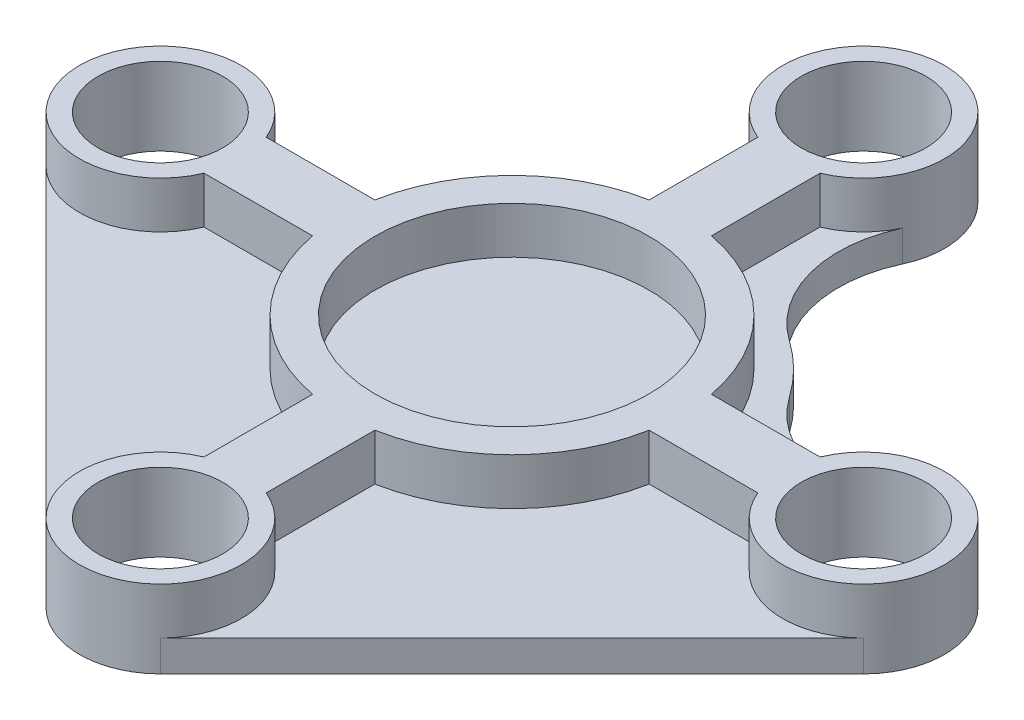
ISO-10303-21;
HEADER;
FILE_DESCRIPTION(('STEP AP214'),'2;1');
FILE_NAME('part.step','',(''),(''),'','','');
FILE_SCHEMA(('AUTOMOTIVE_DESIGN { 1 0 10303 214 1 1 1 1 }'));
ENDSEC;
DATA;
#1=APPLICATION_CONTEXT('core data for automotive mechanical design processes');
#2=APPLICATION_PROTOCOL_DEFINITION('international standard','automotive_design',2000,#1);
#3=PRODUCT_CONTEXT('',#1,'mechanical');
#4=PRODUCT('Part','Part','',(#3));
#5=PRODUCT_RELATED_PRODUCT_CATEGORY('part','',(#4));
#6=PRODUCT_DEFINITION_FORMATION('','',#4);
#7=PRODUCT_DEFINITION_CONTEXT('part definition',#1,'design');
#8=PRODUCT_DEFINITION('design','',#6,#7);
#9=PRODUCT_DEFINITION_SHAPE('','',#8);
#10=(LENGTH_UNIT() NAMED_UNIT(*) SI_UNIT(.MILLI.,.METRE.));
#11=(NAMED_UNIT(*) PLANE_ANGLE_UNIT() SI_UNIT($,.RADIAN.));
#12=(NAMED_UNIT(*) SI_UNIT($,.STERADIAN.) SOLID_ANGLE_UNIT());
#13=UNCERTAINTY_MEASURE_WITH_UNIT(LENGTH_MEASURE(1.E-05),#10,'distance_accuracy_value','');
#14=(GEOMETRIC_REPRESENTATION_CONTEXT(3) GLOBAL_UNCERTAINTY_ASSIGNED_CONTEXT((#13)) GLOBAL_UNIT_ASSIGNED_CONTEXT((#10,
#11,#12)) REPRESENTATION_CONTEXT('',''));
#15=CARTESIAN_POINT('',(0.,0.,0.));
#16=DIRECTION('',(0.,0.,1.));
#17=DIRECTION('',(1.,0.,0.));
#18=AXIS2_PLACEMENT_3D('',#15,#16,#17);
#19=CARTESIAN_POINT('',(-59.8055256368753,10.,-85.0840707964602));
#20=DIRECTION('',(0.,1.,0.));
#21=DIRECTION('',(0.,0.,1.));
#22=AXIS2_PLACEMENT_3D('',#19,#20,#21);
#23=PLANE('',#22);
#24=CARTESIAN_POINT('',(-113.,10.,0.));
#25=DIRECTION('',(0.,1.,0.));
#26=DIRECTION('',(0.,0.,1.));
#27=AXIS2_PLACEMENT_3D('',#24,#25,#26);
#28=CIRCLE('',#27,26.);
#29=CARTESIAN_POINT('',(-89.,10.,-9.99999999999998));
#30=VERTEX_POINT('',#29);
#31=CARTESIAN_POINT('',(-102.002815768302,10.,-23.5597525236176));
#32=VERTEX_POINT('',#31);
#33=EDGE_CURVE('E281',#30,#32,#28,.T.);
#34=ORIENTED_EDGE('',*,*,#33,.F.);
#35=DIRECTION('',(1.,0.,0.));
#36=VECTOR('',#35,1.);
#37=CARTESIAN_POINT('',(-89.,10.,-9.99999999999998));
#38=LINE('',#37,#36);
#39=CARTESIAN_POINT('',(-54.0832691319598,10.,-9.99999999999999));
#40=VERTEX_POINT('',#39);
#41=EDGE_CURVE('E244',#30,#40,#38,.T.);
#42=ORIENTED_EDGE('',*,*,#41,.T.);
#43=CARTESIAN_POINT('',(0.,10.,0.));
#44=DIRECTION('',(0.,1.,0.));
#45=DIRECTION('',(0.,0.,1.));
#46=AXIS2_PLACEMENT_3D('',#43,#44,#45);
#47=CIRCLE('',#46,55.);
#48=CARTESIAN_POINT('',(-9.99999999999999,10.,-54.0832691319598));
#49=VERTEX_POINT('',#48);
#50=EDGE_CURVE('E472',#49,#40,#47,.T.);
#51=ORIENTED_EDGE('',*,*,#50,.F.);
#52=DIRECTION('',(0.,0.,-1.));
#53=VECTOR('',#52,1.);
#54=CARTESIAN_POINT('',(-10.,10.,-89.));
#55=LINE('',#54,#53);
#56=CARTESIAN_POINT('',(-10.,10.,-89.));
#57=VERTEX_POINT('',#56);
#58=EDGE_CURVE('E561',#49,#57,#55,.T.);
#59=ORIENTED_EDGE('',*,*,#58,.T.);
#60=CARTESIAN_POINT('',(0.,10.,-113.));
#61=DIRECTION('',(0.,1.,0.));
#62=DIRECTION('',(0.,0.,1.));
#63=AXIS2_PLACEMENT_3D('',#60,#61,#62);
#64=CIRCLE('',#63,26.);
#65=CARTESIAN_POINT('',(-23.5597525236176,10.,-102.002815768302));
#66=VERTEX_POINT('',#65);
#67=EDGE_CURVE('E54',#66,#57,#64,.T.);
#68=ORIENTED_EDGE('',*,*,#67,.F.);
#69=CARTESIAN_POINT('',(-59.8055256368753,10.,-85.0840707964602));
#70=DIRECTION('',(0.,-1.,0.));
#71=DIRECTION('',(0.,0.,1.));
#72=AXIS2_PLACEMENT_3D('',#69,#70,#71);
#73=CIRCLE('',#72,40.);
#74=CARTESIAN_POINT('',(-36.8034003919233,10.,-52.359428182437));
#75=VERTEX_POINT('',#74);
#76=EDGE_CURVE('E294',#66,#75,#73,.T.);
#77=ORIENTED_EDGE('',*,*,#76,.T.);
#78=CARTESIAN_POINT('',(0.,10.,0.));
#79=DIRECTION('',(0.,1.,0.));
#80=DIRECTION('',(0.,0.,1.));
#81=AXIS2_PLACEMENT_3D('',#78,#79,#80);
#82=CIRCLE('',#81,64.);
#83=CARTESIAN_POINT('',(-52.359428182437,10.,-36.8034003919233));
#84=VERTEX_POINT('',#83);
#85=EDGE_CURVE('E298',#75,#84,#82,.T.);
#86=ORIENTED_EDGE('',*,*,#85,.T.);
#87=CARTESIAN_POINT('',(-85.0840707964602,10.,-59.8055256368753));
#88=DIRECTION('',(0.,-1.,0.));
#89=DIRECTION('',(0.,0.,1.));
#90=AXIS2_PLACEMENT_3D('',#87,#88,#89);
#91=CIRCLE('',#90,40.);
#92=EDGE_CURVE('E302',#84,#32,#91,.T.);
#93=ORIENTED_EDGE('',*,*,#92,.T.);
#94=EDGE_LOOP('',(#34,#42,#51,#59,#68,#77,#86,#93));
#95=FACE_BOUND('',#94,.T.);
#96=ADVANCED_FACE('F45',(#95),#23,.T.);
#97=CARTESIAN_POINT('',(10.,10.,-89.));
#98=VERTEX_POINT('',#97);
#99=CARTESIAN_POINT('',(23.5597525236176,10.,-102.002815768302));
#100=VERTEX_POINT('',#99);
#101=EDGE_CURVE('E264',#98,#100,#64,.T.);
#102=ORIENTED_EDGE('',*,*,#101,.F.);
#103=DIRECTION('',(0.,0.,1.));
#104=VECTOR('',#103,1.);
#105=CARTESIAN_POINT('',(10.,10.,-89.));
#106=LINE('',#105,#104);
#107=CARTESIAN_POINT('',(9.99999999999999,10.,-54.0832691319598));
#108=VERTEX_POINT('',#107);
#109=EDGE_CURVE('E256',#98,#108,#106,.T.);
#110=ORIENTED_EDGE('',*,*,#109,.T.);
#111=CARTESIAN_POINT('',(54.0832691319598,10.,-10.));
#112=VERTEX_POINT('',#111);
#113=EDGE_CURVE('E254',#112,#108,#47,.T.);
#114=ORIENTED_EDGE('',*,*,#113,.F.);
#115=DIRECTION('',(1.,0.,0.));
#116=VECTOR('',#115,1.);
#117=CARTESIAN_POINT('',(89.,10.,-10.));
#118=LINE('',#117,#116);
#119=CARTESIAN_POINT('',(89.,10.,-10.));
#120=VERTEX_POINT('',#119);
#121=EDGE_CURVE('E234',#112,#120,#118,.T.);
#122=ORIENTED_EDGE('',*,*,#121,.T.);
#123=CARTESIAN_POINT('',(113.,10.,0.));
#124=DIRECTION('',(0.,1.,0.));
#125=DIRECTION('',(0.,0.,1.));
#126=AXIS2_PLACEMENT_3D('',#123,#124,#125);
#127=CIRCLE('',#126,26.);
#128=CARTESIAN_POINT('',(102.002815768302,10.,-23.5597525236176));
#129=VERTEX_POINT('',#128);
#130=EDGE_CURVE('E250',#129,#120,#127,.T.);
#131=ORIENTED_EDGE('',*,*,#130,.F.);
#132=CARTESIAN_POINT('',(85.0840707964602,10.,-59.8055256368753));
#133=DIRECTION('',(0.,-1.,0.));
#134=DIRECTION('',(0.,0.,-1.));
#135=AXIS2_PLACEMENT_3D('',#132,#133,#134);
#136=CIRCLE('',#135,40.);
#137=CARTESIAN_POINT('',(52.359428182437,10.,-36.8034003919233));
#138=VERTEX_POINT('',#137);
#139=EDGE_CURVE('E314',#129,#138,#136,.T.);
#140=ORIENTED_EDGE('',*,*,#139,.T.);
#141=CARTESIAN_POINT('',(0.,10.,0.));
#142=DIRECTION('',(0.,1.,0.));
#143=DIRECTION('',(0.,0.,1.));
#144=AXIS2_PLACEMENT_3D('',#141,#142,#143);
#145=CIRCLE('',#144,64.);
#146=CARTESIAN_POINT('',(36.8034003919233,10.,-52.359428182437));
#147=VERTEX_POINT('',#146);
#148=EDGE_CURVE('E317',#138,#147,#145,.T.);
#149=ORIENTED_EDGE('',*,*,#148,.T.);
#150=CARTESIAN_POINT('',(59.8055256368753,10.,-85.0840707964602));
#151=DIRECTION('',(0.,-1.,0.));
#152=DIRECTION('',(0.,0.,-1.));
#153=AXIS2_PLACEMENT_3D('',#150,#151,#152);
#154=CIRCLE('',#153,40.);
#155=EDGE_CURVE('E320',#147,#100,#154,.T.);
#156=ORIENTED_EDGE('',*,*,#155,.T.);
#157=EDGE_LOOP('',(#102,#110,#114,#122,#131,#140,#149,#156));
#158=FACE_BOUND('',#157,.T.);
#159=ADVANCED_FACE('F249',(#158),#23,.T.);
#160=CARTESIAN_POINT('',(0.,25.,0.));
#161=DIRECTION('',(0.,-1.,0.));
#162=DIRECTION('',(0.,0.,-1.));
#163=AXIS2_PLACEMENT_3D('',#160,#161,#162);
#164=CYLINDRICAL_SURFACE('',#163,55.);
#165=DIRECTION('',(0.,1.,0.));
#166=VECTOR('',#165,1.);
#167=CARTESIAN_POINT('',(-54.0832691319598,10.,-9.99999999999999));
#168=LINE('',#167,#166);
#169=CARTESIAN_POINT('',(-54.0832691319598,25.,-9.99999999999999));
#170=VERTEX_POINT('',#169);
#171=EDGE_CURVE('E496',#40,#170,#168,.T.);
#172=ORIENTED_EDGE('',*,*,#171,.T.);
#173=CARTESIAN_POINT('',(0.,25.,0.));
#174=DIRECTION('',(0.,1.,0.));
#175=DIRECTION('',(0.,0.,1.));
#176=AXIS2_PLACEMENT_3D('',#173,#174,#175);
#177=CIRCLE('',#176,55.);
#178=CARTESIAN_POINT('',(-9.99999999999999,25.,-54.0832691319598));
#179=VERTEX_POINT('',#178);
#180=EDGE_CURVE('E467',#179,#170,#177,.T.);
#181=ORIENTED_EDGE('',*,*,#180,.F.);
#182=DIRECTION('',(0.,1.,0.));
#183=VECTOR('',#182,1.);
#184=CARTESIAN_POINT('',(-9.99999999999999,10.,-54.0832691319598));
#185=LINE('',#184,#183);
#186=EDGE_CURVE('E492',#49,#179,#185,.T.);
#187=ORIENTED_EDGE('',*,*,#186,.F.);
#188=ORIENTED_EDGE('',*,*,#50,.T.);
#189=EDGE_LOOP('',(#172,#181,#187,#188));
#190=FACE_BOUND('',#189,.T.);
#191=ADVANCED_FACE('F583',(#190),#164,.T.);
#192=DIRECTION('',(0.,1.,0.));
#193=VECTOR('',#192,1.);
#194=CARTESIAN_POINT('',(9.99999999999999,10.,-54.0832691319598));
#195=LINE('',#194,#193);
#196=CARTESIAN_POINT('',(9.99999999999999,25.,-54.0832691319598));
#197=VERTEX_POINT('',#196);
#198=EDGE_CURVE('E498',#108,#197,#195,.T.);
#199=ORIENTED_EDGE('',*,*,#198,.T.);
#200=CARTESIAN_POINT('',(54.0832691319598,25.,-10.));
#201=VERTEX_POINT('',#200);
#202=EDGE_CURVE('E466',#201,#197,#177,.T.);
#203=ORIENTED_EDGE('',*,*,#202,.F.);
#204=DIRECTION('',(0.,1.,0.));
#205=VECTOR('',#204,1.);
#206=CARTESIAN_POINT('',(54.0832691319598,10.,-10.));
#207=LINE('',#206,#205);
#208=EDGE_CURVE('E243',#112,#201,#207,.T.);
#209=ORIENTED_EDGE('',*,*,#208,.F.);
#210=ORIENTED_EDGE('',*,*,#113,.T.);
#211=EDGE_LOOP('',(#199,#203,#209,#210));
#212=FACE_BOUND('',#211,.T.);
#213=ADVANCED_FACE('F557',(#212),#164,.T.);
#214=CARTESIAN_POINT('',(-113.,10.,0.));
#215=DIRECTION('',(0.,-1.,0.));
#216=DIRECTION('',(0.,0.,-1.));
#217=AXIS2_PLACEMENT_3D('',#214,#215,#216);
#218=CYLINDRICAL_SURFACE('',#217,26.);
#219=DIRECTION('',(0.,1.,0.));
#220=VECTOR('',#219,1.);
#221=CARTESIAN_POINT('',(-89.,10.,-9.99999999999998));
#222=LINE('',#221,#220);
#223=CARTESIAN_POINT('',(-89.,25.,-9.99999999999998));
#224=VERTEX_POINT('',#223);
#225=EDGE_CURVE('E414',#30,#224,#222,.T.);
#226=ORIENTED_EDGE('',*,*,#225,.F.);
#227=ORIENTED_EDGE('',*,*,#33,.T.);
#228=DIRECTION('',(0.,-1.,0.));
#229=VECTOR('',#228,1.);
#230=CARTESIAN_POINT('',(-102.002815768302,10.,-23.5597525236176));
#231=LINE('',#230,#229);
#232=CARTESIAN_POINT('',(-102.002815768302,0.,-23.5597525236176));
#233=VERTEX_POINT('',#232);
#234=EDGE_CURVE('E394',#32,#233,#231,.T.);
#235=ORIENTED_EDGE('',*,*,#234,.T.);
#236=CARTESIAN_POINT('',(-113.,0.,0.));
#237=DIRECTION('',(0.,1.,0.));
#238=DIRECTION('',(0.,0.,1.));
#239=AXIS2_PLACEMENT_3D('',#236,#237,#238);
#240=CIRCLE('',#239,26.);
#241=CARTESIAN_POINT('',(-131.38477631085,0.,18.3847763108502));
#242=VERTEX_POINT('',#241);
#243=EDGE_CURVE('E335',#233,#242,#240,.T.);
#244=ORIENTED_EDGE('',*,*,#243,.T.);
#245=DIRECTION('',(0.,-1.,0.));
#246=VECTOR('',#245,1.);
#247=CARTESIAN_POINT('',(-131.38477631085,10.,18.3847763108502));
#248=LINE('',#247,#246);
#249=CARTESIAN_POINT('',(-131.38477631085,10.,18.3847763108502));
#250=VERTEX_POINT('',#249);
#251=EDGE_CURVE('E390',#250,#242,#248,.T.);
#252=ORIENTED_EDGE('',*,*,#251,.F.);
#253=CARTESIAN_POINT('',(-89.,10.,10.));
#254=VERTEX_POINT('',#253);
#255=EDGE_CURVE('E270',#250,#254,#28,.T.);
#256=ORIENTED_EDGE('',*,*,#255,.T.);
#257=DIRECTION('',(0.,1.,0.));
#258=VECTOR('',#257,1.);
#259=CARTESIAN_POINT('',(-89.,10.,10.));
#260=LINE('',#259,#258);
#261=CARTESIAN_POINT('',(-89.,25.,10.));
#262=VERTEX_POINT('',#261);
#263=EDGE_CURVE('E442',#254,#262,#260,.T.);
#264=ORIENTED_EDGE('',*,*,#263,.T.);
#265=CARTESIAN_POINT('',(-113.,25.,0.));
#266=DIRECTION('',(0.,1.,0.));
#267=DIRECTION('',(0.,0.,1.));
#268=AXIS2_PLACEMENT_3D('',#265,#266,#267);
#269=CIRCLE('',#268,26.);
#270=EDGE_CURVE('E277',#224,#262,#269,.T.);
#271=ORIENTED_EDGE('',*,*,#270,.F.);
#272=EDGE_LOOP('',(#226,#227,#235,#244,#252,#256,#264,#271));
#273=FACE_BOUND('',#272,.T.);
#274=ADVANCED_FACE('F411',(#273),#218,.T.);
#275=CARTESIAN_POINT('',(113.,10.,0.));
#276=DIRECTION('',(0.,-1.,0.));
#277=DIRECTION('',(0.,0.,-1.));
#278=AXIS2_PLACEMENT_3D('',#275,#276,#277);
#279=CYLINDRICAL_SURFACE('',#278,26.);
#280=DIRECTION('',(0.,1.,0.));
#281=VECTOR('',#280,1.);
#282=CARTESIAN_POINT('',(89.,10.,-10.));
#283=LINE('',#282,#281);
#284=CARTESIAN_POINT('',(89.,25.,-10.));
#285=VERTEX_POINT('',#284);
#286=EDGE_CURVE('E231',#120,#285,#283,.T.);
#287=ORIENTED_EDGE('',*,*,#286,.T.);
#288=CARTESIAN_POINT('',(113.,25.,0.));
#289=DIRECTION('',(0.,1.,0.));
#290=DIRECTION('',(0.,0.,1.));
#291=AXIS2_PLACEMENT_3D('',#288,#289,#290);
#292=CIRCLE('',#291,26.);
#293=CARTESIAN_POINT('',(89.,25.,9.99999999999999));
#294=VERTEX_POINT('',#293);
#295=EDGE_CURVE('E273',#294,#285,#292,.T.);
#296=ORIENTED_EDGE('',*,*,#295,.F.);
#297=DIRECTION('',(0.,1.,0.));
#298=VECTOR('',#297,1.);
#299=CARTESIAN_POINT('',(89.,10.,9.99999999999999));
#300=LINE('',#299,#298);
#301=CARTESIAN_POINT('',(89.,10.,9.99999999999999));
#302=VERTEX_POINT('',#301);
#303=EDGE_CURVE('E462',#302,#294,#300,.T.);
#304=ORIENTED_EDGE('',*,*,#303,.F.);
#305=CARTESIAN_POINT('',(131.38477631085,10.,18.3847763108502));
#306=VERTEX_POINT('',#305);
#307=EDGE_CURVE('E265',#302,#306,#127,.T.);
#308=ORIENTED_EDGE('',*,*,#307,.T.);
#309=DIRECTION('',(0.,-1.,0.));
#310=VECTOR('',#309,1.);
#311=CARTESIAN_POINT('',(131.38477631085,10.,18.3847763108502));
#312=LINE('',#311,#310);
#313=CARTESIAN_POINT('',(131.38477631085,0.,18.3847763108502));
#314=VERTEX_POINT('',#313);
#315=EDGE_CURVE('E378',#306,#314,#312,.T.);
#316=ORIENTED_EDGE('',*,*,#315,.T.);
#317=CARTESIAN_POINT('',(113.,0.,0.));
#318=DIRECTION('',(0.,1.,0.));
#319=DIRECTION('',(0.,0.,1.));
#320=AXIS2_PLACEMENT_3D('',#317,#318,#319);
#321=CIRCLE('',#320,26.);
#322=CARTESIAN_POINT('',(102.002815768302,0.,-23.5597525236176));
#323=VERTEX_POINT('',#322);
#324=EDGE_CURVE('E347',#314,#323,#321,.T.);
#325=ORIENTED_EDGE('',*,*,#324,.T.);
#326=DIRECTION('',(0.,-1.,0.));
#327=VECTOR('',#326,1.);
#328=CARTESIAN_POINT('',(102.002815768302,10.,-23.5597525236176));
#329=LINE('',#328,#327);
#330=EDGE_CURVE('E261',#129,#323,#329,.T.);
#331=ORIENTED_EDGE('',*,*,#330,.F.);
#332=ORIENTED_EDGE('',*,*,#130,.T.);
#333=EDGE_LOOP('',(#287,#296,#304,#308,#316,#325,#331,#332));
#334=FACE_BOUND('',#333,.T.);
#335=ADVANCED_FACE('F259',(#334),#279,.T.);
#336=CARTESIAN_POINT('',(0.,10.,-113.));
#337=DIRECTION('',(0.,-1.,0.));
#338=DIRECTION('',(0.,0.,-1.));
#339=AXIS2_PLACEMENT_3D('',#336,#337,#338);
#340=CYLINDRICAL_SURFACE('',#339,26.);
#341=DIRECTION('',(0.,1.,0.));
#342=VECTOR('',#341,1.);
#343=CARTESIAN_POINT('',(-10.,10.,-89.));
#344=LINE('',#343,#342);
#345=CARTESIAN_POINT('',(-10.,25.,-89.));
#346=VERTEX_POINT('',#345);
#347=EDGE_CURVE('E487',#57,#346,#344,.T.);
#348=ORIENTED_EDGE('',*,*,#347,.T.);
#349=CARTESIAN_POINT('',(0.,25.,-113.));
#350=DIRECTION('',(0.,1.,0.));
#351=DIRECTION('',(0.,0.,1.));
#352=AXIS2_PLACEMENT_3D('',#349,#350,#351);
#353=CIRCLE('',#352,26.);
#354=CARTESIAN_POINT('',(10.,25.,-89.));
#355=VERTEX_POINT('',#354);
#356=EDGE_CURVE('E276',#355,#346,#353,.T.);
#357=ORIENTED_EDGE('',*,*,#356,.F.);
#358=DIRECTION('',(0.,1.,0.));
#359=VECTOR('',#358,1.);
#360=CARTESIAN_POINT('',(10.,10.,-89.));
#361=LINE('',#360,#359);
#362=EDGE_CURVE('E485',#98,#355,#361,.T.);
#363=ORIENTED_EDGE('',*,*,#362,.F.);
#364=ORIENTED_EDGE('',*,*,#101,.T.);
#365=DIRECTION('',(0.,-1.,0.));
#366=VECTOR('',#365,1.);
#367=CARTESIAN_POINT('',(23.5597525236176,10.,-102.002815768302));
#368=LINE('',#367,#366);
#369=CARTESIAN_POINT('',(23.5597525236176,0.,-102.002815768302));
#370=VERTEX_POINT('',#369);
#371=EDGE_CURVE('E364',#100,#370,#368,.T.);
#372=ORIENTED_EDGE('',*,*,#371,.T.);
#373=CARTESIAN_POINT('',(0.,0.,-113.));
#374=DIRECTION('',(0.,1.,0.));
#375=DIRECTION('',(0.,0.,1.));
#376=AXIS2_PLACEMENT_3D('',#373,#374,#375);
#377=CIRCLE('',#376,26.);
#378=CARTESIAN_POINT('',(-23.5597525236176,0.,-102.002815768302));
#379=VERTEX_POINT('',#378);
#380=EDGE_CURVE('E299',#370,#379,#377,.T.);
#381=ORIENTED_EDGE('',*,*,#380,.T.);
#382=DIRECTION('',(0.,-1.,0.));
#383=VECTOR('',#382,1.);
#384=CARTESIAN_POINT('',(-23.5597525236176,10.,-102.002815768302));
#385=LINE('',#384,#383);
#386=EDGE_CURVE('E324',#66,#379,#385,.T.);
#387=ORIENTED_EDGE('',*,*,#386,.F.);
#388=ORIENTED_EDGE('',*,*,#67,.T.);
#389=EDGE_LOOP('',(#348,#357,#363,#364,#372,#381,#387,#388));
#390=FACE_BOUND('',#389,.T.);
#391=ADVANCED_FACE('F484',(#390),#340,.T.);
#392=CARTESIAN_POINT('',(0.,10.,113.));
#393=DIRECTION('',(0.,-1.,0.));
#394=DIRECTION('',(0.,0.,-1.));
#395=AXIS2_PLACEMENT_3D('',#392,#393,#394);
#396=CYLINDRICAL_SURFACE('',#395,26.);
#397=DIRECTION('',(0.,1.,0.));
#398=VECTOR('',#397,1.);
#399=CARTESIAN_POINT('',(10.,10.,89.));
#400=LINE('',#399,#398);
#401=CARTESIAN_POINT('',(10.,10.,89.));
#402=VERTEX_POINT('',#401);
#403=CARTESIAN_POINT('',(10.,25.,89.));
#404=VERTEX_POINT('',#403);
#405=EDGE_CURVE('E536',#402,#404,#400,.T.);
#406=ORIENTED_EDGE('',*,*,#405,.T.);
#407=CARTESIAN_POINT('',(0.,25.,113.));
#408=DIRECTION('',(0.,1.,0.));
#409=DIRECTION('',(0.,0.,1.));
#410=AXIS2_PLACEMENT_3D('',#407,#408,#409);
#411=CIRCLE('',#410,26.);
#412=CARTESIAN_POINT('',(-9.99999999999999,25.,89.));
#413=VERTEX_POINT('',#412);
#414=EDGE_CURVE('E289',#413,#404,#411,.T.);
#415=ORIENTED_EDGE('',*,*,#414,.F.);
#416=DIRECTION('',(0.,1.,0.));
#417=VECTOR('',#416,1.);
#418=CARTESIAN_POINT('',(-9.99999999999999,10.,89.));
#419=LINE('',#418,#417);
#420=CARTESIAN_POINT('',(-9.99999999999999,10.,89.));
#421=VERTEX_POINT('',#420);
#422=EDGE_CURVE('E540',#421,#413,#419,.T.);
#423=ORIENTED_EDGE('',*,*,#422,.F.);
#424=CARTESIAN_POINT('',(0.,10.,113.));
#425=DIRECTION('',(0.,1.,0.));
#426=DIRECTION('',(0.,0.,1.));
#427=AXIS2_PLACEMENT_3D('',#424,#425,#426);
#428=CIRCLE('',#427,26.);
#429=CARTESIAN_POINT('',(-18.3847763108503,10.,131.38477631085));
#430=VERTEX_POINT('',#429);
#431=EDGE_CURVE('E288',#421,#430,#428,.T.);
#432=ORIENTED_EDGE('',*,*,#431,.T.);
#433=DIRECTION('',(0.,-1.,0.));
#434=VECTOR('',#433,1.);
#435=CARTESIAN_POINT('',(-18.3847763108503,10.,131.38477631085));
#436=LINE('',#435,#434);
#437=CARTESIAN_POINT('',(-18.3847763108503,0.,131.38477631085));
#438=VERTEX_POINT('',#437);
#439=EDGE_CURVE('E386',#430,#438,#436,.T.);
#440=ORIENTED_EDGE('',*,*,#439,.T.);
#441=CARTESIAN_POINT('',(0.,0.,113.));
#442=DIRECTION('',(0.,1.,0.));
#443=DIRECTION('',(0.,0.,1.));
#444=AXIS2_PLACEMENT_3D('',#441,#442,#443);
#445=CIRCLE('',#444,26.);
#446=CARTESIAN_POINT('',(18.3847763108503,0.,131.38477631085));
#447=VERTEX_POINT('',#446);
#448=EDGE_CURVE('E341',#438,#447,#445,.T.);
#449=ORIENTED_EDGE('',*,*,#448,.T.);
#450=DIRECTION('',(0.,-1.,0.));
#451=VECTOR('',#450,1.);
#452=CARTESIAN_POINT('',(18.3847763108503,10.,131.38477631085));
#453=LINE('',#452,#451);
#454=CARTESIAN_POINT('',(18.3847763108503,10.,131.38477631085));
#455=VERTEX_POINT('',#454);
#456=EDGE_CURVE('E382',#455,#447,#453,.T.);
#457=ORIENTED_EDGE('',*,*,#456,.F.);
#458=EDGE_CURVE('E284',#455,#402,#428,.T.);
#459=ORIENTED_EDGE('',*,*,#458,.T.);
#460=EDGE_LOOP('',(#406,#415,#423,#432,#440,#449,#457,#459));
#461=FACE_BOUND('',#460,.T.);
#462=ADVANCED_FACE('F612',(#461),#396,.T.);
#463=ORIENTED_EDGE('',*,*,#307,.F.);
#464=DIRECTION('',(-1.,0.,0.));
#465=VECTOR('',#464,1.);
#466=CARTESIAN_POINT('',(89.,10.,9.99999999999999));
#467=LINE('',#466,#465);
#468=CARTESIAN_POINT('',(54.0832691319598,10.,10.));
#469=VERTEX_POINT('',#468);
#470=EDGE_CURVE('E446',#302,#469,#467,.T.);
#471=ORIENTED_EDGE('',*,*,#470,.T.);
#472=CARTESIAN_POINT('',(10.,10.,54.0832691319598));
#473=VERTEX_POINT('',#472);
#474=EDGE_CURVE('E469',#473,#469,#47,.T.);
#475=ORIENTED_EDGE('',*,*,#474,.F.);
#476=DIRECTION('',(0.,0.,1.));
#477=VECTOR('',#476,1.);
#478=CARTESIAN_POINT('',(10.,10.,89.));
#479=LINE('',#478,#477);
#480=EDGE_CURVE('E453',#473,#402,#479,.T.);
#481=ORIENTED_EDGE('',*,*,#480,.T.);
#482=ORIENTED_EDGE('',*,*,#458,.F.);
#483=DIRECTION('',(0.707106781186547,0.,-0.707106781186547));
#484=VECTOR('',#483,1.);
#485=CARTESIAN_POINT('',(18.3847763108503,10.,131.38477631085));
#486=LINE('',#485,#484);
#487=EDGE_CURVE('E310',#455,#306,#486,.T.);
#488=ORIENTED_EDGE('',*,*,#487,.T.);
#489=EDGE_LOOP('',(#463,#471,#475,#481,#482,#488));
#490=FACE_BOUND('',#489,.T.);
#491=ADVANCED_FACE('F604',(#490),#23,.T.);
#492=ORIENTED_EDGE('',*,*,#431,.F.);
#493=DIRECTION('',(0.,0.,-1.));
#494=VECTOR('',#493,1.);
#495=CARTESIAN_POINT('',(-9.99999999999999,10.,89.));
#496=LINE('',#495,#494);
#497=CARTESIAN_POINT('',(-10.,10.,54.0832691319598));
#498=VERTEX_POINT('',#497);
#499=EDGE_CURVE('E509',#421,#498,#496,.T.);
#500=ORIENTED_EDGE('',*,*,#499,.T.);
#501=CARTESIAN_POINT('',(-54.0832691319598,10.,10.));
#502=VERTEX_POINT('',#501);
#503=EDGE_CURVE('E461',#502,#498,#47,.T.);
#504=ORIENTED_EDGE('',*,*,#503,.F.);
#505=DIRECTION('',(-1.,0.,0.));
#506=VECTOR('',#505,1.);
#507=CARTESIAN_POINT('',(-89.,10.,10.));
#508=LINE('',#507,#506);
#509=EDGE_CURVE('E440',#502,#254,#508,.T.);
#510=ORIENTED_EDGE('',*,*,#509,.T.);
#511=ORIENTED_EDGE('',*,*,#255,.F.);
#512=DIRECTION('',(0.707106781186547,0.,0.707106781186547));
#513=VECTOR('',#512,1.);
#514=CARTESIAN_POINT('',(-18.3847763108503,10.,131.38477631085));
#515=LINE('',#514,#513);
#516=EDGE_CURVE('E306',#250,#430,#515,.T.);
#517=ORIENTED_EDGE('',*,*,#516,.T.);
#518=EDGE_LOOP('',(#492,#500,#504,#510,#511,#517));
#519=FACE_BOUND('',#518,.T.);
#520=ADVANCED_FACE('F436',(#519),#23,.T.);
#521=DIRECTION('',(0.,1.,0.));
#522=VECTOR('',#521,1.);
#523=CARTESIAN_POINT('',(54.0832691319598,10.,10.));
#524=LINE('',#523,#522);
#525=CARTESIAN_POINT('',(54.0832691319598,25.,10.));
#526=VERTEX_POINT('',#525);
#527=EDGE_CURVE('E528',#469,#526,#524,.T.);
#528=ORIENTED_EDGE('',*,*,#527,.T.);
#529=CARTESIAN_POINT('',(10.,25.,54.0832691319598));
#530=VERTEX_POINT('',#529);
#531=EDGE_CURVE('E293',#530,#526,#177,.T.);
#532=ORIENTED_EDGE('',*,*,#531,.F.);
#533=DIRECTION('',(0.,1.,0.));
#534=VECTOR('',#533,1.);
#535=CARTESIAN_POINT('',(10.,10.,54.0832691319598));
#536=LINE('',#535,#534);
#537=EDGE_CURVE('E532',#473,#530,#536,.T.);
#538=ORIENTED_EDGE('',*,*,#537,.F.);
#539=ORIENTED_EDGE('',*,*,#474,.T.);
#540=EDGE_LOOP('',(#528,#532,#538,#539));
#541=FACE_BOUND('',#540,.T.);
#542=ADVANCED_FACE('F619',(#541),#164,.T.);
#543=DIRECTION('',(0.,1.,0.));
#544=VECTOR('',#543,1.);
#545=CARTESIAN_POINT('',(-10.,10.,54.0832691319598));
#546=LINE('',#545,#544);
#547=CARTESIAN_POINT('',(-10.,25.,54.0832691319598));
#548=VERTEX_POINT('',#547);
#549=EDGE_CURVE('E450',#498,#548,#546,.T.);
#550=ORIENTED_EDGE('',*,*,#549,.T.);
#551=CARTESIAN_POINT('',(-54.0832691319598,25.,10.));
#552=VERTEX_POINT('',#551);
#553=EDGE_CURVE('E468',#552,#548,#177,.T.);
#554=ORIENTED_EDGE('',*,*,#553,.F.);
#555=DIRECTION('',(0.,1.,0.));
#556=VECTOR('',#555,1.);
#557=CARTESIAN_POINT('',(-54.0832691319598,10.,10.));
#558=LINE('',#557,#556);
#559=EDGE_CURVE('E445',#502,#552,#558,.T.);
#560=ORIENTED_EDGE('',*,*,#559,.F.);
#561=ORIENTED_EDGE('',*,*,#503,.T.);
#562=EDGE_LOOP('',(#550,#554,#560,#561));
#563=FACE_BOUND('',#562,.T.);
#564=ADVANCED_FACE('F547',(#563),#164,.T.);
#565=CARTESIAN_POINT('',(-59.8055256368753,10.,-85.0840707964602));
#566=DIRECTION('',(0.,-1.,0.));
#567=DIRECTION('',(0.,0.,-1.));
#568=AXIS2_PLACEMENT_3D('',#565,#566,#567);
#569=CYLINDRICAL_SURFACE('',#568,40.);
#570=CARTESIAN_POINT('',(-59.8055256368753,0.,-85.0840707964602));
#571=DIRECTION('',(0.,-1.,0.));
#572=DIRECTION('',(0.,0.,1.));
#573=AXIS2_PLACEMENT_3D('',#570,#571,#572);
#574=CIRCLE('',#573,40.);
#575=CARTESIAN_POINT('',(-36.8034003919233,0.,-52.359428182437));
#576=VERTEX_POINT('',#575);
#577=EDGE_CURVE('E325',#379,#576,#574,.T.);
#578=ORIENTED_EDGE('',*,*,#577,.T.);
#579=DIRECTION('',(0.,-1.,0.));
#580=VECTOR('',#579,1.);
#581=CARTESIAN_POINT('',(-36.8034003919233,10.,-52.359428182437));
#582=LINE('',#581,#580);
#583=EDGE_CURVE('E401',#75,#576,#582,.T.);
#584=ORIENTED_EDGE('',*,*,#583,.F.);
#585=ORIENTED_EDGE('',*,*,#76,.F.);
#586=ORIENTED_EDGE('',*,*,#386,.T.);
#587=EDGE_LOOP('',(#578,#584,#585,#586));
#588=FACE_BOUND('',#587,.T.);
#589=ADVANCED_FACE('F47',(#588),#569,.F.);
#590=CARTESIAN_POINT('',(0.,10.,0.));
#591=DIRECTION('',(0.,-1.,0.));
#592=DIRECTION('',(0.,0.,-1.));
#593=AXIS2_PLACEMENT_3D('',#590,#591,#592);
#594=CYLINDRICAL_SURFACE('',#593,64.);
#595=CARTESIAN_POINT('',(0.,0.,0.));
#596=DIRECTION('',(0.,1.,0.));
#597=DIRECTION('',(0.,0.,1.));
#598=AXIS2_PLACEMENT_3D('',#595,#596,#597);
#599=CIRCLE('',#598,64.);
#600=CARTESIAN_POINT('',(-52.359428182437,0.,-36.8034003919233));
#601=VERTEX_POINT('',#600);
#602=EDGE_CURVE('E329',#576,#601,#599,.T.);
#603=ORIENTED_EDGE('',*,*,#602,.T.);
#604=DIRECTION('',(0.,-1.,0.));
#605=VECTOR('',#604,1.);
#606=CARTESIAN_POINT('',(-52.359428182437,10.,-36.8034003919233));
#607=LINE('',#606,#605);
#608=EDGE_CURVE('E398',#84,#601,#607,.T.);
#609=ORIENTED_EDGE('',*,*,#608,.F.);
#610=ORIENTED_EDGE('',*,*,#85,.F.);
#611=ORIENTED_EDGE('',*,*,#583,.T.);
#612=EDGE_LOOP('',(#603,#609,#610,#611));
#613=FACE_BOUND('',#612,.T.);
#614=ADVANCED_FACE('F423',(#613),#594,.T.);
#615=CARTESIAN_POINT('',(-85.0840707964602,10.,-59.8055256368753));
#616=DIRECTION('',(0.,-1.,0.));
#617=DIRECTION('',(0.,0.,-1.));
#618=AXIS2_PLACEMENT_3D('',#615,#616,#617);
#619=CYLINDRICAL_SURFACE('',#618,40.);
#620=CARTESIAN_POINT('',(-85.0840707964602,0.,-59.8055256368753));
#621=DIRECTION('',(0.,-1.,0.));
#622=DIRECTION('',(0.,0.,1.));
#623=AXIS2_PLACEMENT_3D('',#620,#621,#622);
#624=CIRCLE('',#623,40.);
#625=EDGE_CURVE('E332',#601,#233,#624,.T.);
#626=ORIENTED_EDGE('',*,*,#625,.T.);
#627=ORIENTED_EDGE('',*,*,#234,.F.);
#628=ORIENTED_EDGE('',*,*,#92,.F.);
#629=ORIENTED_EDGE('',*,*,#608,.T.);
#630=EDGE_LOOP('',(#626,#627,#628,#629));
#631=FACE_BOUND('',#630,.T.);
#632=ADVANCED_FACE('F419',(#631),#619,.F.);
#633=CARTESIAN_POINT('',(-18.3847763108503,10.,131.38477631085));
#634=DIRECTION('',(0.707106781186548,0.,-0.707106781186547));
#635=DIRECTION('',(-0.707106781186547,0.,-0.707106781186548));
#636=AXIS2_PLACEMENT_3D('',#633,#634,#635);
#637=PLANE('',#636);
#638=DIRECTION('',(0.707106781186547,0.,0.707106781186547));
#639=VECTOR('',#638,1.);
#640=CARTESIAN_POINT('',(-18.3847763108503,0.,131.38477631085));
#641=LINE('',#640,#639);
#642=EDGE_CURVE('E338',#242,#438,#641,.T.);
#643=ORIENTED_EDGE('',*,*,#642,.T.);
#644=ORIENTED_EDGE('',*,*,#439,.F.);
#645=ORIENTED_EDGE('',*,*,#516,.F.);
#646=ORIENTED_EDGE('',*,*,#251,.T.);
#647=EDGE_LOOP('',(#643,#644,#645,#646));
#648=FACE_BOUND('',#647,.T.);
#649=ADVANCED_FACE('F432',(#648),#637,.F.);
#650=CARTESIAN_POINT('',(18.3847763108503,10.,131.38477631085));
#651=DIRECTION('',(-0.707106781186548,0.,-0.707106781186547));
#652=DIRECTION('',(-0.707106781186547,0.,0.707106781186548));
#653=AXIS2_PLACEMENT_3D('',#650,#651,#652);
#654=PLANE('',#653);
#655=DIRECTION('',(0.707106781186547,0.,-0.707106781186547));
#656=VECTOR('',#655,1.);
#657=CARTESIAN_POINT('',(18.3847763108503,0.,131.38477631085));
#658=LINE('',#657,#656);
#659=EDGE_CURVE('E344',#447,#314,#658,.T.);
#660=ORIENTED_EDGE('',*,*,#659,.T.);
#661=ORIENTED_EDGE('',*,*,#315,.F.);
#662=ORIENTED_EDGE('',*,*,#487,.F.);
#663=ORIENTED_EDGE('',*,*,#456,.T.);
#664=EDGE_LOOP('',(#660,#661,#662,#663));
#665=FACE_BOUND('',#664,.T.);
#666=ADVANCED_FACE('F690',(#665),#654,.F.);
#667=CARTESIAN_POINT('',(85.0840707964602,10.,-59.8055256368753));
#668=DIRECTION('',(0.,-1.,0.));
#669=DIRECTION('',(0.,0.,-1.));
#670=AXIS2_PLACEMENT_3D('',#667,#668,#669);
#671=CYLINDRICAL_SURFACE('',#670,40.);
#672=CARTESIAN_POINT('',(85.0840707964602,0.,-59.8055256368753));
#673=DIRECTION('',(0.,-1.,0.));
#674=DIRECTION('',(0.,0.,-1.));
#675=AXIS2_PLACEMENT_3D('',#672,#673,#674);
#676=CIRCLE('',#675,40.);
#677=CARTESIAN_POINT('',(52.359428182437,0.,-36.8034003919233));
#678=VERTEX_POINT('',#677);
#679=EDGE_CURVE('E350',#323,#678,#676,.T.);
#680=ORIENTED_EDGE('',*,*,#679,.T.);
#681=DIRECTION('',(0.,-1.,0.));
#682=VECTOR('',#681,1.);
#683=CARTESIAN_POINT('',(52.359428182437,10.,-36.8034003919233));
#684=LINE('',#683,#682);
#685=EDGE_CURVE('E372',#138,#678,#684,.T.);
#686=ORIENTED_EDGE('',*,*,#685,.F.);
#687=ORIENTED_EDGE('',*,*,#139,.F.);
#688=ORIENTED_EDGE('',*,*,#330,.T.);
#689=EDGE_LOOP('',(#680,#686,#687,#688));
#690=FACE_BOUND('',#689,.T.);
#691=ADVANCED_FACE('F689',(#690),#671,.F.);
#692=CARTESIAN_POINT('',(0.,10.,0.));
#693=DIRECTION('',(0.,-1.,0.));
#694=DIRECTION('',(0.,0.,-1.));
#695=AXIS2_PLACEMENT_3D('',#692,#693,#694);
#696=CYLINDRICAL_SURFACE('',#695,64.);
#697=CARTESIAN_POINT('',(0.,0.,0.));
#698=DIRECTION('',(0.,1.,0.));
#699=DIRECTION('',(0.,0.,1.));
#700=AXIS2_PLACEMENT_3D('',#697,#698,#699);
#701=CIRCLE('',#700,64.);
#702=CARTESIAN_POINT('',(36.8034003919233,0.,-52.359428182437));
#703=VERTEX_POINT('',#702);
#704=EDGE_CURVE('E353',#678,#703,#701,.T.);
#705=ORIENTED_EDGE('',*,*,#704,.T.);
#706=DIRECTION('',(0.,-1.,0.));
#707=VECTOR('',#706,1.);
#708=CARTESIAN_POINT('',(36.8034003919233,10.,-52.359428182437));
#709=LINE('',#708,#707);
#710=EDGE_CURVE('E368',#147,#703,#709,.T.);
#711=ORIENTED_EDGE('',*,*,#710,.F.);
#712=ORIENTED_EDGE('',*,*,#148,.F.);
#713=ORIENTED_EDGE('',*,*,#685,.T.);
#714=EDGE_LOOP('',(#705,#711,#712,#713));
#715=FACE_BOUND('',#714,.T.);
#716=ADVANCED_FACE('F684',(#715),#696,.T.);
#717=CARTESIAN_POINT('',(59.8055256368753,10.,-85.0840707964602));
#718=DIRECTION('',(0.,-1.,0.));
#719=DIRECTION('',(0.,0.,-1.));
#720=AXIS2_PLACEMENT_3D('',#717,#718,#719);
#721=CYLINDRICAL_SURFACE('',#720,40.);
#722=CARTESIAN_POINT('',(59.8055256368753,0.,-85.0840707964602));
#723=DIRECTION('',(0.,-1.,0.));
#724=DIRECTION('',(0.,0.,-1.));
#725=AXIS2_PLACEMENT_3D('',#722,#723,#724);
#726=CIRCLE('',#725,40.);
#727=EDGE_CURVE('E356',#703,#370,#726,.T.);
#728=ORIENTED_EDGE('',*,*,#727,.T.);
#729=ORIENTED_EDGE('',*,*,#371,.F.);
#730=ORIENTED_EDGE('',*,*,#155,.F.);
#731=ORIENTED_EDGE('',*,*,#710,.T.);
#732=EDGE_LOOP('',(#728,#729,#730,#731));
#733=FACE_BOUND('',#732,.T.);
#734=ADVANCED_FACE('F679',(#733),#721,.F.);
#735=CARTESIAN_POINT('',(-59.8055256368753,0.,-85.0840707964602));
#736=DIRECTION('',(0.,1.,0.));
#737=DIRECTION('',(0.,0.,1.));
#738=AXIS2_PLACEMENT_3D('',#735,#736,#737);
#739=PLANE('',#738);
#740=CARTESIAN_POINT('',(0.,0.,-113.));
#741=DIRECTION('',(0.,1.,0.));
#742=DIRECTION('',(0.,0.,1.));
#743=AXIS2_PLACEMENT_3D('',#740,#741,#742);
#744=CIRCLE('',#743,20.);
#745=CARTESIAN_POINT('',(0.,0.,-93.));
#746=VERTEX_POINT('',#745);
#747=EDGE_CURVE('E709',#746,#746,#744,.T.);
#748=ORIENTED_EDGE('',*,*,#747,.T.);
#749=EDGE_LOOP('',(#748));
#750=FACE_BOUND('',#749,.T.);
#751=CARTESIAN_POINT('',(-113.,0.,0.));
#752=DIRECTION('',(0.,1.,0.));
#753=DIRECTION('',(0.,0.,1.));
#754=AXIS2_PLACEMENT_3D('',#751,#752,#753);
#755=CIRCLE('',#754,20.);
#756=CARTESIAN_POINT('',(-113.,0.,20.));
#757=VERTEX_POINT('',#756);
#758=EDGE_CURVE('E713',#757,#757,#755,.T.);
#759=ORIENTED_EDGE('',*,*,#758,.T.);
#760=EDGE_LOOP('',(#759));
#761=FACE_BOUND('',#760,.T.);
#762=CARTESIAN_POINT('',(113.,0.,0.));
#763=DIRECTION('',(0.,1.,0.));
#764=DIRECTION('',(0.,0.,1.));
#765=AXIS2_PLACEMENT_3D('',#762,#763,#764);
#766=CIRCLE('',#765,20.);
#767=CARTESIAN_POINT('',(113.,0.,20.));
#768=VERTEX_POINT('',#767);
#769=EDGE_CURVE('E717',#768,#768,#766,.T.);
#770=ORIENTED_EDGE('',*,*,#769,.T.);
#771=EDGE_LOOP('',(#770));
#772=FACE_BOUND('',#771,.T.);
#773=CARTESIAN_POINT('',(0.,0.,113.));
#774=DIRECTION('',(0.,1.,0.));
#775=DIRECTION('',(0.,0.,1.));
#776=AXIS2_PLACEMENT_3D('',#773,#774,#775);
#777=CIRCLE('',#776,20.);
#778=CARTESIAN_POINT('',(0.,0.,133.));
#779=VERTEX_POINT('',#778);
#780=EDGE_CURVE('E571',#779,#779,#777,.T.);
#781=ORIENTED_EDGE('',*,*,#780,.T.);
#782=EDGE_LOOP('',(#781));
#783=FACE_BOUND('',#782,.T.);
#784=ORIENTED_EDGE('',*,*,#577,.F.);
#785=ORIENTED_EDGE('',*,*,#380,.F.);
#786=ORIENTED_EDGE('',*,*,#727,.F.);
#787=ORIENTED_EDGE('',*,*,#704,.F.);
#788=ORIENTED_EDGE('',*,*,#679,.F.);
#789=ORIENTED_EDGE('',*,*,#324,.F.);
#790=ORIENTED_EDGE('',*,*,#659,.F.);
#791=ORIENTED_EDGE('',*,*,#448,.F.);
#792=ORIENTED_EDGE('',*,*,#642,.F.);
#793=ORIENTED_EDGE('',*,*,#243,.F.);
#794=ORIENTED_EDGE('',*,*,#625,.F.);
#795=ORIENTED_EDGE('',*,*,#602,.F.);
#796=EDGE_LOOP('',(#784,#785,#786,#787,#788,#789,#790,#791,#792,#793,#794,#795));
#797=FACE_BOUND('',#796,.T.);
#798=ADVANCED_FACE('F426',(#750,#761,#772,#783,#797),#739,.F.);
#799=CARTESIAN_POINT('',(0.,25.,-113.));
#800=DIRECTION('',(0.,1.,0.));
#801=DIRECTION('',(0.,0.,1.));
#802=AXIS2_PLACEMENT_3D('',#799,#800,#801);
#803=PLANE('',#802);
#804=CARTESIAN_POINT('',(0.,25.,-113.));
#805=DIRECTION('',(0.,1.,0.));
#806=DIRECTION('',(0.,0.,1.));
#807=AXIS2_PLACEMENT_3D('',#804,#805,#806);
#808=CIRCLE('',#807,20.);
#809=CARTESIAN_POINT('',(0.,25.,-93.));
#810=VERTEX_POINT('',#809);
#811=EDGE_CURVE('E741',#810,#810,#808,.T.);
#812=ORIENTED_EDGE('',*,*,#811,.F.);
#813=EDGE_LOOP('',(#812));
#814=FACE_BOUND('',#813,.T.);
#815=CARTESIAN_POINT('',(-113.,25.,0.));
#816=DIRECTION('',(0.,1.,0.));
#817=DIRECTION('',(0.,0.,1.));
#818=AXIS2_PLACEMENT_3D('',#815,#816,#817);
#819=CIRCLE('',#818,20.);
#820=CARTESIAN_POINT('',(-113.,25.,20.));
#821=VERTEX_POINT('',#820);
#822=EDGE_CURVE('E735',#821,#821,#819,.T.);
#823=ORIENTED_EDGE('',*,*,#822,.F.);
#824=EDGE_LOOP('',(#823));
#825=FACE_BOUND('',#824,.T.);
#826=CARTESIAN_POINT('',(113.,25.,0.));
#827=DIRECTION('',(0.,1.,0.));
#828=DIRECTION('',(0.,0.,1.));
#829=AXIS2_PLACEMENT_3D('',#826,#827,#828);
#830=CIRCLE('',#829,20.);
#831=CARTESIAN_POINT('',(113.,25.,20.));
#832=VERTEX_POINT('',#831);
#833=EDGE_CURVE('E729',#832,#832,#830,.T.);
#834=ORIENTED_EDGE('',*,*,#833,.F.);
#835=EDGE_LOOP('',(#834));
#836=FACE_BOUND('',#835,.T.);
#837=CARTESIAN_POINT('',(0.,25.,113.));
#838=DIRECTION('',(0.,1.,0.));
#839=DIRECTION('',(0.,0.,1.));
#840=AXIS2_PLACEMENT_3D('',#837,#838,#839);
#841=CIRCLE('',#840,20.);
#842=CARTESIAN_POINT('',(0.,25.,133.));
#843=VERTEX_POINT('',#842);
#844=EDGE_CURVE('E722',#843,#843,#841,.T.);
#845=ORIENTED_EDGE('',*,*,#844,.F.);
#846=EDGE_LOOP('',(#845));
#847=FACE_BOUND('',#846,.T.);
#848=DIRECTION('',(1.,0.,0.));
#849=VECTOR('',#848,1.);
#850=CARTESIAN_POINT('',(89.,25.,-10.));
#851=LINE('',#850,#849);
#852=EDGE_CURVE('E237',#201,#285,#851,.T.);
#853=ORIENTED_EDGE('',*,*,#852,.F.);
#854=ORIENTED_EDGE('',*,*,#202,.T.);
#855=DIRECTION('',(0.,0.,1.));
#856=VECTOR('',#855,1.);
#857=CARTESIAN_POINT('',(10.,25.,-89.));
#858=LINE('',#857,#856);
#859=EDGE_CURVE('E61',#355,#197,#858,.T.);
#860=ORIENTED_EDGE('',*,*,#859,.F.);
#861=ORIENTED_EDGE('',*,*,#356,.T.);
#862=DIRECTION('',(0.,0.,-1.));
#863=VECTOR('',#862,1.);
#864=CARTESIAN_POINT('',(-10.,25.,-89.));
#865=LINE('',#864,#863);
#866=EDGE_CURVE('E479',#179,#346,#865,.T.);
#867=ORIENTED_EDGE('',*,*,#866,.F.);
#868=ORIENTED_EDGE('',*,*,#180,.T.);
#869=DIRECTION('',(1.,0.,0.));
#870=VECTOR('',#869,1.);
#871=CARTESIAN_POINT('',(-89.,25.,-9.99999999999998));
#872=LINE('',#871,#870);
#873=EDGE_CURVE('E257',#224,#170,#872,.T.);
#874=ORIENTED_EDGE('',*,*,#873,.F.);
#875=ORIENTED_EDGE('',*,*,#270,.T.);
#876=DIRECTION('',(-1.,0.,0.));
#877=VECTOR('',#876,1.);
#878=CARTESIAN_POINT('',(-89.,25.,10.));
#879=LINE('',#878,#877);
#880=EDGE_CURVE('E68',#552,#262,#879,.T.);
#881=ORIENTED_EDGE('',*,*,#880,.F.);
#882=ORIENTED_EDGE('',*,*,#553,.T.);
#883=DIRECTION('',(0.,0.,-1.));
#884=VECTOR('',#883,1.);
#885=CARTESIAN_POINT('',(-9.99999999999999,25.,89.));
#886=LINE('',#885,#884);
#887=EDGE_CURVE('E518',#413,#548,#886,.T.);
#888=ORIENTED_EDGE('',*,*,#887,.F.);
#889=ORIENTED_EDGE('',*,*,#414,.T.);
#890=DIRECTION('',(0.,0.,1.));
#891=VECTOR('',#890,1.);
#892=CARTESIAN_POINT('',(10.,25.,89.));
#893=LINE('',#892,#891);
#894=EDGE_CURVE('E521',#530,#404,#893,.T.);
#895=ORIENTED_EDGE('',*,*,#894,.F.);
#896=ORIENTED_EDGE('',*,*,#531,.T.);
#897=DIRECTION('',(-1.,0.,0.));
#898=VECTOR('',#897,1.);
#899=CARTESIAN_POINT('',(89.,25.,9.99999999999999));
#900=LINE('',#899,#898);
#901=EDGE_CURVE('E510',#294,#526,#900,.T.);
#902=ORIENTED_EDGE('',*,*,#901,.F.);
#903=ORIENTED_EDGE('',*,*,#295,.T.);
#904=EDGE_LOOP('',(#853,#854,#860,#861,#867,#868,#874,#875,#881,#882,#888,#889,#895,#896,#902,#903));
#905=FACE_BOUND('',#904,.T.);
#906=CARTESIAN_POINT('',(0.,25.,0.));
#907=DIRECTION('',(0.,1.,0.));
#908=DIRECTION('',(0.,0.,1.));
#909=AXIS2_PLACEMENT_3D('',#906,#907,#908);
#910=CIRCLE('',#909,44.);
#911=CARTESIAN_POINT('',(0.,25.,44.));
#912=VERTEX_POINT('',#911);
#913=EDGE_CURVE('E457',#912,#912,#910,.T.);
#914=ORIENTED_EDGE('',*,*,#913,.F.);
#915=EDGE_LOOP('',(#914));
#916=FACE_BOUND('',#915,.T.);
#917=ADVANCED_FACE('F476',(#814,#825,#836,#847,#905,#916),#803,.T.);
#918=CARTESIAN_POINT('',(0.,25.,0.));
#919=DIRECTION('',(0.,-1.,0.));
#920=DIRECTION('',(0.,0.,-1.));
#921=AXIS2_PLACEMENT_3D('',#918,#919,#920);
#922=CYLINDRICAL_SURFACE('',#921,44.);
#923=ORIENTED_EDGE('',*,*,#913,.T.);
#924=EDGE_LOOP('',(#923));
#925=FACE_BOUND('',#924,.T.);
#926=CARTESIAN_POINT('',(0.,10.,0.));
#927=DIRECTION('',(0.,1.,0.));
#928=DIRECTION('',(0.,0.,1.));
#929=AXIS2_PLACEMENT_3D('',#926,#927,#928);
#930=CIRCLE('',#929,44.);
#931=CARTESIAN_POINT('',(0.,10.,44.));
#932=VERTEX_POINT('',#931);
#933=EDGE_CURVE('E11',#932,#932,#930,.F.);
#934=ORIENTED_EDGE('',*,*,#933,.T.);
#935=EDGE_LOOP('',(#934));
#936=FACE_BOUND('',#935,.T.);
#937=ADVANCED_FACE('F625',(#925,#936),#922,.F.);
#938=ORIENTED_EDGE('',*,*,#933,.F.);
#939=EDGE_LOOP('',(#938));
#940=FACE_BOUND('',#939,.T.);
#941=ADVANCED_FACE('F614',(#940),#23,.T.);
#942=CARTESIAN_POINT('',(-89.,10.,10.));
#943=DIRECTION('',(0.,0.,-1.));
#944=DIRECTION('',(-1.,0.,0.));
#945=AXIS2_PLACEMENT_3D('',#942,#943,#944);
#946=PLANE('',#945);
#947=ORIENTED_EDGE('',*,*,#880,.T.);
#948=ORIENTED_EDGE('',*,*,#263,.F.);
#949=ORIENTED_EDGE('',*,*,#509,.F.);
#950=ORIENTED_EDGE('',*,*,#559,.T.);
#951=EDGE_LOOP('',(#947,#948,#949,#950));
#952=FACE_BOUND('',#951,.T.);
#953=ADVANCED_FACE('F624',(#952),#946,.F.);
#954=CARTESIAN_POINT('',(-9.99999999999999,10.,89.));
#955=DIRECTION('',(1.,0.,0.));
#956=DIRECTION('',(0.,0.,-1.));
#957=AXIS2_PLACEMENT_3D('',#954,#955,#956);
#958=PLANE('',#957);
#959=ORIENTED_EDGE('',*,*,#887,.T.);
#960=ORIENTED_EDGE('',*,*,#549,.F.);
#961=ORIENTED_EDGE('',*,*,#499,.F.);
#962=ORIENTED_EDGE('',*,*,#422,.T.);
#963=EDGE_LOOP('',(#959,#960,#961,#962));
#964=FACE_BOUND('',#963,.T.);
#965=ADVANCED_FACE('F631',(#964),#958,.F.);
#966=CARTESIAN_POINT('',(10.,10.,89.));
#967=DIRECTION('',(-1.,0.,0.));
#968=DIRECTION('',(0.,0.,1.));
#969=AXIS2_PLACEMENT_3D('',#966,#967,#968);
#970=PLANE('',#969);
#971=ORIENTED_EDGE('',*,*,#894,.T.);
#972=ORIENTED_EDGE('',*,*,#405,.F.);
#973=ORIENTED_EDGE('',*,*,#480,.F.);
#974=ORIENTED_EDGE('',*,*,#537,.T.);
#975=EDGE_LOOP('',(#971,#972,#973,#974));
#976=FACE_BOUND('',#975,.T.);
#977=ADVANCED_FACE('F880',(#976),#970,.F.);
#978=CARTESIAN_POINT('',(89.,10.,9.99999999999999));
#979=DIRECTION('',(0.,0.,-1.));
#980=DIRECTION('',(-1.,0.,0.));
#981=AXIS2_PLACEMENT_3D('',#978,#979,#980);
#982=PLANE('',#981);
#983=ORIENTED_EDGE('',*,*,#901,.T.);
#984=ORIENTED_EDGE('',*,*,#527,.F.);
#985=ORIENTED_EDGE('',*,*,#470,.F.);
#986=ORIENTED_EDGE('',*,*,#303,.T.);
#987=EDGE_LOOP('',(#983,#984,#985,#986));
#988=FACE_BOUND('',#987,.T.);
#989=ADVANCED_FACE('F811',(#988),#982,.F.);
#990=CARTESIAN_POINT('',(89.,10.,-10.));
#991=DIRECTION('',(0.,0.,1.));
#992=DIRECTION('',(1.,0.,0.));
#993=AXIS2_PLACEMENT_3D('',#990,#991,#992);
#994=PLANE('',#993);
#995=ORIENTED_EDGE('',*,*,#852,.T.);
#996=ORIENTED_EDGE('',*,*,#286,.F.);
#997=ORIENTED_EDGE('',*,*,#121,.F.);
#998=ORIENTED_EDGE('',*,*,#208,.T.);
#999=EDGE_LOOP('',(#995,#996,#997,#998));
#1000=FACE_BOUND('',#999,.T.);
#1001=ADVANCED_FACE('F233',(#1000),#994,.F.);
#1002=CARTESIAN_POINT('',(-89.,10.,-9.99999999999998));
#1003=DIRECTION('',(0.,0.,1.));
#1004=DIRECTION('',(1.,0.,0.));
#1005=AXIS2_PLACEMENT_3D('',#1002,#1003,#1004);
#1006=PLANE('',#1005);
#1007=ORIENTED_EDGE('',*,*,#873,.T.);
#1008=ORIENTED_EDGE('',*,*,#171,.F.);
#1009=ORIENTED_EDGE('',*,*,#41,.F.);
#1010=ORIENTED_EDGE('',*,*,#225,.T.);
#1011=EDGE_LOOP('',(#1007,#1008,#1009,#1010));
#1012=FACE_BOUND('',#1011,.T.);
#1013=ADVANCED_FACE('F588',(#1012),#1006,.F.);
#1014=CARTESIAN_POINT('',(-10.,10.,-89.));
#1015=DIRECTION('',(1.,0.,0.));
#1016=DIRECTION('',(0.,0.,-1.));
#1017=AXIS2_PLACEMENT_3D('',#1014,#1015,#1016);
#1018=PLANE('',#1017);
#1019=ORIENTED_EDGE('',*,*,#866,.T.);
#1020=ORIENTED_EDGE('',*,*,#347,.F.);
#1021=ORIENTED_EDGE('',*,*,#58,.F.);
#1022=ORIENTED_EDGE('',*,*,#186,.T.);
#1023=EDGE_LOOP('',(#1019,#1020,#1021,#1022));
#1024=FACE_BOUND('',#1023,.T.);
#1025=ADVANCED_FACE('F592',(#1024),#1018,.F.);
#1026=CARTESIAN_POINT('',(10.,10.,-89.));
#1027=DIRECTION('',(-1.,0.,0.));
#1028=DIRECTION('',(0.,0.,1.));
#1029=AXIS2_PLACEMENT_3D('',#1026,#1027,#1028);
#1030=PLANE('',#1029);
#1031=ORIENTED_EDGE('',*,*,#859,.T.);
#1032=ORIENTED_EDGE('',*,*,#198,.F.);
#1033=ORIENTED_EDGE('',*,*,#109,.F.);
#1034=ORIENTED_EDGE('',*,*,#362,.T.);
#1035=EDGE_LOOP('',(#1031,#1032,#1033,#1034));
#1036=FACE_BOUND('',#1035,.T.);
#1037=ADVANCED_FACE('F559',(#1036),#1030,.F.);
#1038=CARTESIAN_POINT('',(0.,25.,113.));
#1039=DIRECTION('',(0.,1.,0.));
#1040=DIRECTION('',(0.,0.,1.));
#1041=AXIS2_PLACEMENT_3D('',#1038,#1039,#1040);
#1042=CYLINDRICAL_SURFACE('',#1041,20.);
#1043=ORIENTED_EDGE('',*,*,#780,.F.);
#1044=EDGE_LOOP('',(#1043));
#1045=FACE_BOUND('',#1044,.T.);
#1046=ORIENTED_EDGE('',*,*,#844,.T.);
#1047=EDGE_LOOP('',(#1046));
#1048=FACE_BOUND('',#1047,.T.);
#1049=ADVANCED_FACE('F599',(#1045,#1048),#1042,.F.);
#1050=CARTESIAN_POINT('',(113.,25.,0.));
#1051=DIRECTION('',(0.,1.,0.));
#1052=DIRECTION('',(0.,0.,1.));
#1053=AXIS2_PLACEMENT_3D('',#1050,#1051,#1052);
#1054=CYLINDRICAL_SURFACE('',#1053,20.);
#1055=ORIENTED_EDGE('',*,*,#769,.F.);
#1056=EDGE_LOOP('',(#1055));
#1057=FACE_BOUND('',#1056,.T.);
#1058=ORIENTED_EDGE('',*,*,#833,.T.);
#1059=EDGE_LOOP('',(#1058));
#1060=FACE_BOUND('',#1059,.T.);
#1061=ADVANCED_FACE('F755',(#1057,#1060),#1054,.F.);
#1062=CARTESIAN_POINT('',(-113.,25.,0.));
#1063=DIRECTION('',(0.,1.,0.));
#1064=DIRECTION('',(0.,0.,1.));
#1065=AXIS2_PLACEMENT_3D('',#1062,#1063,#1064);
#1066=CYLINDRICAL_SURFACE('',#1065,20.);
#1067=ORIENTED_EDGE('',*,*,#758,.F.);
#1068=EDGE_LOOP('',(#1067));
#1069=FACE_BOUND('',#1068,.T.);
#1070=ORIENTED_EDGE('',*,*,#822,.T.);
#1071=EDGE_LOOP('',(#1070));
#1072=FACE_BOUND('',#1071,.T.);
#1073=ADVANCED_FACE('F760',(#1069,#1072),#1066,.F.);
#1074=CARTESIAN_POINT('',(0.,25.,-113.));
#1075=DIRECTION('',(0.,1.,0.));
#1076=DIRECTION('',(0.,0.,1.));
#1077=AXIS2_PLACEMENT_3D('',#1074,#1075,#1076);
#1078=CYLINDRICAL_SURFACE('',#1077,20.);
#1079=ORIENTED_EDGE('',*,*,#747,.F.);
#1080=EDGE_LOOP('',(#1079));
#1081=FACE_BOUND('',#1080,.T.);
#1082=ORIENTED_EDGE('',*,*,#811,.T.);
#1083=EDGE_LOOP('',(#1082));
#1084=FACE_BOUND('',#1083,.T.);
#1085=ADVANCED_FACE('F746',(#1081,#1084),#1078,.F.);
#1086=CLOSED_SHELL('',(#96,#159,#191,#213,#274,#335,#391,#462,#491,#520,#542,#564,#589,#614,
#632,#649,#666,#691,#716,#734,#798,#917,#937,#941,#953,#965,#977,#989,#1001,#1013,#1025,#1037,
#1049,#1061,#1073,#1085));
#1087=MANIFOLD_SOLID_BREP('B2',#1086);
#1088=ADVANCED_BREP_SHAPE_REPRESENTATION('',(#18,#1087),#14);
#1089=SHAPE_DEFINITION_REPRESENTATION(#9,#1088);
ENDSEC;
END-ISO-10303-21;
